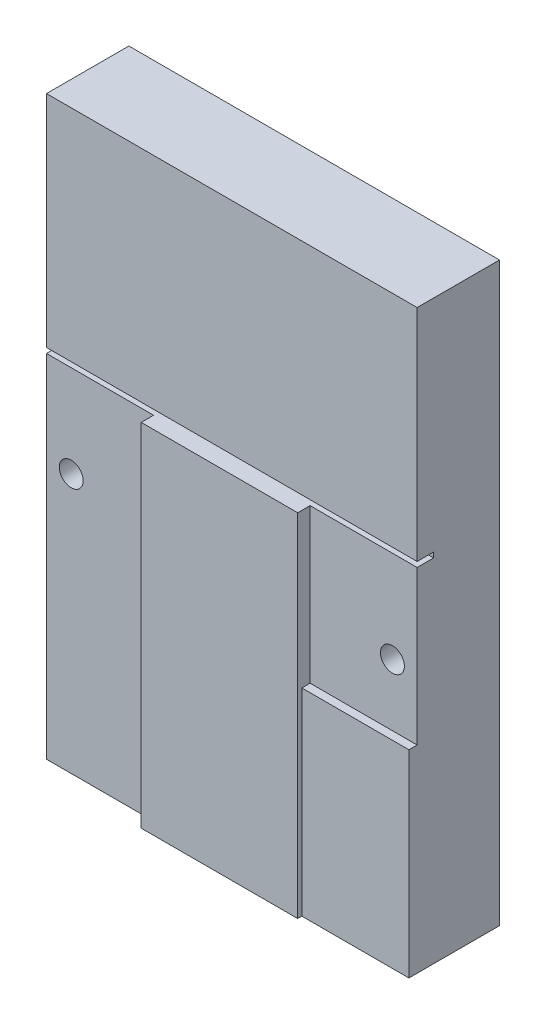
ISO-10303-21;
HEADER;
FILE_DESCRIPTION(('STEP AP214'),'2;1');
FILE_NAME('part.step','',(''),(''),'','','');
FILE_SCHEMA(('AUTOMOTIVE_DESIGN { 1 0 10303 214 1 1 1 1 }'));
ENDSEC;
DATA;
#1=APPLICATION_CONTEXT('core data for automotive mechanical design processes');
#2=APPLICATION_PROTOCOL_DEFINITION('international standard','automotive_design',2000,#1);
#3=PRODUCT_CONTEXT('',#1,'mechanical');
#4=PRODUCT('Part','Part','',(#3));
#5=PRODUCT_RELATED_PRODUCT_CATEGORY('part','',(#4));
#6=PRODUCT_DEFINITION_FORMATION('','',#4);
#7=PRODUCT_DEFINITION_CONTEXT('part definition',#1,'design');
#8=PRODUCT_DEFINITION('design','',#6,#7);
#9=PRODUCT_DEFINITION_SHAPE('','',#8);
#10=(LENGTH_UNIT() NAMED_UNIT(*) SI_UNIT(.MILLI.,.METRE.));
#11=(NAMED_UNIT(*) PLANE_ANGLE_UNIT() SI_UNIT($,.RADIAN.));
#12=(NAMED_UNIT(*) SI_UNIT($,.STERADIAN.) SOLID_ANGLE_UNIT());
#13=UNCERTAINTY_MEASURE_WITH_UNIT(LENGTH_MEASURE(1.E-05),#10,'distance_accuracy_value','');
#14=(GEOMETRIC_REPRESENTATION_CONTEXT(3) GLOBAL_UNCERTAINTY_ASSIGNED_CONTEXT((#13)) GLOBAL_UNIT_ASSIGNED_CONTEXT((#10,
#11,#12)) REPRESENTATION_CONTEXT('',''));
#15=CARTESIAN_POINT('',(0.,0.,0.));
#16=DIRECTION('',(0.,0.,1.));
#17=DIRECTION('',(1.,0.,0.));
#18=AXIS2_PLACEMENT_3D('',#15,#16,#17);
#19=CARTESIAN_POINT('',(22.5,40.,5.));
#20=DIRECTION('',(0.,0.,-1.));
#21=DIRECTION('',(-1.,0.,0.));
#22=AXIS2_PLACEMENT_3D('',#19,#20,#21);
#23=PLANE('',#22);
#24=CARTESIAN_POINT('',(19.5,11.5,5.));
#25=DIRECTION('',(0.,0.,1.));
#26=DIRECTION('',(1.,0.,0.));
#27=AXIS2_PLACEMENT_3D('',#24,#25,#26);
#28=CIRCLE('',#27,1.45);
#29=CARTESIAN_POINT('',(20.95,11.5,5.));
#30=VERTEX_POINT('',#29);
#31=EDGE_CURVE('E222',#30,#30,#28,.T.);
#32=ORIENTED_EDGE('',*,*,#31,.F.);
#33=EDGE_LOOP('',(#32));
#34=FACE_BOUND('',#33,.T.);
#35=DIRECTION('',(-1.,0.,0.));
#36=VECTOR('',#35,1.);
#37=CARTESIAN_POINT('',(0.,4.,5.));
#38=LINE('',#37,#36);
#39=CARTESIAN_POINT('',(22.5,4.,5.));
#40=VERTEX_POINT('',#39);
#41=CARTESIAN_POINT('',(9.49999999999999,4.,5.));
#42=VERTEX_POINT('',#41);
#43=EDGE_CURVE('E162',#40,#42,#38,.T.);
#44=ORIENTED_EDGE('',*,*,#43,.F.);
#45=DIRECTION('',(0.,-1.,0.));
#46=VECTOR('',#45,1.);
#47=CARTESIAN_POINT('',(22.5,40.,5.));
#48=LINE('',#47,#46);
#49=CARTESIAN_POINT('',(22.5,22.6713275749144,5.));
#50=VERTEX_POINT('',#49);
#51=EDGE_CURVE('E169',#50,#40,#48,.T.);
#52=ORIENTED_EDGE('',*,*,#51,.F.);
#53=DIRECTION('',(1.,0.,0.));
#54=VECTOR('',#53,1.);
#55=CARTESIAN_POINT('',(-22.5,22.6713275749144,5.));
#56=LINE('',#55,#54);
#57=CARTESIAN_POINT('',(9.49999999999998,22.6713275749144,5.));
#58=VERTEX_POINT('',#57);
#59=EDGE_CURVE('E196',#58,#50,#56,.T.);
#60=ORIENTED_EDGE('',*,*,#59,.F.);
#61=DIRECTION('',(0.,1.,0.));
#62=VECTOR('',#61,1.);
#63=CARTESIAN_POINT('',(9.49999999999999,22.6713275749144,5.));
#64=LINE('',#63,#62);
#65=EDGE_CURVE('E67',#42,#58,#64,.T.);
#66=ORIENTED_EDGE('',*,*,#65,.F.);
#67=EDGE_LOOP('',(#44,#52,#60,#66));
#68=FACE_BOUND('',#67,.T.);
#69=ADVANCED_FACE('F43',(#34,#68),#23,.F.);
#70=CARTESIAN_POINT('',(9.49999999999999,22.6713275749144,6.5));
#71=DIRECTION('',(-1.,0.,0.));
#72=DIRECTION('',(0.,-1.,0.));
#73=AXIS2_PLACEMENT_3D('',#70,#71,#72);
#74=PLANE('',#73);
#75=DIRECTION('',(0.,0.,-1.));
#76=VECTOR('',#75,1.);
#77=CARTESIAN_POINT('',(9.49999999999999,4.,6.));
#78=LINE('',#77,#76);
#79=CARTESIAN_POINT('',(9.49999999999999,4.,6.));
#80=VERTEX_POINT('',#79);
#81=EDGE_CURVE('E60',#80,#42,#78,.T.);
#82=ORIENTED_EDGE('',*,*,#81,.T.);
#83=ORIENTED_EDGE('',*,*,#65,.T.);
#84=DIRECTION('',(0.,0.,-1.));
#85=VECTOR('',#84,1.);
#86=CARTESIAN_POINT('',(9.49999999999999,22.6713275749144,6.5));
#87=LINE('',#86,#85);
#88=CARTESIAN_POINT('',(9.49999999999999,22.6713275749144,6.5));
#89=VERTEX_POINT('',#88);
#90=EDGE_CURVE('E189',#89,#58,#87,.T.);
#91=ORIENTED_EDGE('',*,*,#90,.F.);
#92=DIRECTION('',(0.,1.,0.));
#93=VECTOR('',#92,1.);
#94=CARTESIAN_POINT('',(9.49999999999999,22.6713275749144,6.5));
#95=LINE('',#94,#93);
#96=CARTESIAN_POINT('',(9.5,-20.,6.5));
#97=VERTEX_POINT('',#96);
#98=EDGE_CURVE('E182',#97,#89,#95,.T.);
#99=ORIENTED_EDGE('',*,*,#98,.F.);
#100=DIRECTION('',(0.,0.,-1.));
#101=VECTOR('',#100,1.);
#102=CARTESIAN_POINT('',(9.5,-20.,6.5));
#103=LINE('',#102,#101);
#104=CARTESIAN_POINT('',(9.49999999999998,-20.,6.));
#105=VERTEX_POINT('',#104);
#106=EDGE_CURVE('E191',#97,#105,#103,.T.);
#107=ORIENTED_EDGE('',*,*,#106,.T.);
#108=DIRECTION('',(0.,-1.,0.));
#109=VECTOR('',#108,1.);
#110=CARTESIAN_POINT('',(9.49999999999999,0.,6.));
#111=LINE('',#110,#109);
#112=EDGE_CURVE('E152',#80,#105,#111,.T.);
#113=ORIENTED_EDGE('',*,*,#112,.F.);
#114=EDGE_LOOP('',(#82,#83,#91,#99,#107,#113));
#115=FACE_BOUND('',#114,.T.);
#116=ADVANCED_FACE('F282',(#115),#74,.F.);
#117=CARTESIAN_POINT('',(-19.5,11.5,5.));
#118=DIRECTION('',(0.,0.,1.));
#119=DIRECTION('',(1.,0.,0.));
#120=AXIS2_PLACEMENT_3D('',#117,#118,#119);
#121=CIRCLE('',#120,1.45);
#122=CARTESIAN_POINT('',(-18.05,11.5,5.));
#123=VERTEX_POINT('',#122);
#124=EDGE_CURVE('E216',#123,#123,#121,.T.);
#125=ORIENTED_EDGE('',*,*,#124,.F.);
#126=EDGE_LOOP('',(#125));
#127=FACE_BOUND('',#126,.T.);
#128=DIRECTION('',(0.,-1.,0.));
#129=VECTOR('',#128,1.);
#130=CARTESIAN_POINT('',(-9.50000000000001,22.6713275749144,5.));
#131=LINE('',#130,#129);
#132=CARTESIAN_POINT('',(-9.50000000000001,22.6713275749144,5.));
#133=VERTEX_POINT('',#132);
#134=CARTESIAN_POINT('',(-9.5,-20.,5.));
#135=VERTEX_POINT('',#134);
#136=EDGE_CURVE('E170',#133,#135,#131,.T.);
#137=ORIENTED_EDGE('',*,*,#136,.F.);
#138=CARTESIAN_POINT('',(-22.5,22.6713275749144,5.));
#139=VERTEX_POINT('',#138);
#140=EDGE_CURVE('E209',#139,#133,#56,.T.);
#141=ORIENTED_EDGE('',*,*,#140,.F.);
#142=DIRECTION('',(0.,-1.,0.));
#143=VECTOR('',#142,1.);
#144=CARTESIAN_POINT('',(-22.5,40.,5.00000000000001));
#145=LINE('',#144,#143);
#146=CARTESIAN_POINT('',(-22.5,-20.,5.00000000000001));
#147=VERTEX_POINT('',#146);
#148=EDGE_CURVE('E52',#139,#147,#145,.T.);
#149=ORIENTED_EDGE('',*,*,#148,.T.);
#150=DIRECTION('',(-1.,0.,0.));
#151=VECTOR('',#150,1.);
#152=CARTESIAN_POINT('',(-22.5,-20.,5.00000000000001));
#153=LINE('',#152,#151);
#154=EDGE_CURVE('E236',#135,#147,#153,.T.);
#155=ORIENTED_EDGE('',*,*,#154,.F.);
#156=EDGE_LOOP('',(#137,#141,#149,#155));
#157=FACE_BOUND('',#156,.T.);
#158=ADVANCED_FACE('F285',(#127,#157),#23,.F.);
#159=CARTESIAN_POINT('',(-22.5,50.,5.));
#160=VERTEX_POINT('',#159);
#161=CARTESIAN_POINT('',(-22.5,23.2974929319475,5.));
#162=VERTEX_POINT('',#161);
#163=EDGE_CURVE('E11',#160,#162,#145,.T.);
#164=ORIENTED_EDGE('',*,*,#163,.T.);
#165=DIRECTION('',(-1.,0.,0.));
#166=VECTOR('',#165,1.);
#167=CARTESIAN_POINT('',(-22.5,23.2974929319475,5.));
#168=LINE('',#167,#166);
#169=CARTESIAN_POINT('',(22.5,23.2974929319475,5.));
#170=VERTEX_POINT('',#169);
#171=EDGE_CURVE('E201',#170,#162,#168,.T.);
#172=ORIENTED_EDGE('',*,*,#171,.F.);
#173=CARTESIAN_POINT('',(22.5,50.,5.));
#174=VERTEX_POINT('',#173);
#175=EDGE_CURVE('E254',#174,#170,#48,.T.);
#176=ORIENTED_EDGE('',*,*,#175,.F.);
#177=DIRECTION('',(1.,0.,0.));
#178=VECTOR('',#177,1.);
#179=CARTESIAN_POINT('',(-22.5,50.,5.));
#180=LINE('',#179,#178);
#181=EDGE_CURVE('E241',#160,#174,#180,.T.);
#182=ORIENTED_EDGE('',*,*,#181,.F.);
#183=EDGE_LOOP('',(#164,#172,#176,#182));
#184=FACE_BOUND('',#183,.T.);
#185=ADVANCED_FACE('F284',(#184),#23,.F.);
#186=CARTESIAN_POINT('',(-22.5,40.,-4.99999999999999));
#187=DIRECTION('',(1.,0.,0.));
#188=DIRECTION('',(0.,0.,-1.));
#189=AXIS2_PLACEMENT_3D('',#186,#187,#188);
#190=PLANE('',#189);
#191=DIRECTION('',(0.,-1.,0.));
#192=VECTOR('',#191,1.);
#193=CARTESIAN_POINT('',(-22.5,23.2974929319475,3.));
#194=LINE('',#193,#192);
#195=CARTESIAN_POINT('',(-22.5,23.2974929319475,3.));
#196=VERTEX_POINT('',#195);
#197=CARTESIAN_POINT('',(-22.5,22.6713275749144,3.));
#198=VERTEX_POINT('',#197);
#199=EDGE_CURVE('E197',#196,#198,#194,.T.);
#200=ORIENTED_EDGE('',*,*,#199,.F.);
#201=DIRECTION('',(0.,0.,1.));
#202=VECTOR('',#201,1.);
#203=CARTESIAN_POINT('',(-22.5,23.2974929319475,3.));
#204=LINE('',#203,#202);
#205=EDGE_CURVE('E213',#196,#162,#204,.T.);
#206=ORIENTED_EDGE('',*,*,#205,.T.);
#207=ORIENTED_EDGE('',*,*,#163,.F.);
#208=DIRECTION('',(0.,0.,1.));
#209=VECTOR('',#208,1.);
#210=CARTESIAN_POINT('',(-22.5,50.,-4.99999999999999));
#211=LINE('',#210,#209);
#212=CARTESIAN_POINT('',(-22.5,50.,-4.99999999999999));
#213=VERTEX_POINT('',#212);
#214=EDGE_CURVE('E238',#213,#160,#211,.T.);
#215=ORIENTED_EDGE('',*,*,#214,.F.);
#216=DIRECTION('',(0.,-1.,0.));
#217=VECTOR('',#216,1.);
#218=CARTESIAN_POINT('',(-22.5,40.,-4.99999999999999));
#219=LINE('',#218,#217);
#220=CARTESIAN_POINT('',(-22.5,-20.,-5.));
#221=VERTEX_POINT('',#220);
#222=EDGE_CURVE('E250',#213,#221,#219,.T.);
#223=ORIENTED_EDGE('',*,*,#222,.T.);
#224=DIRECTION('',(0.,0.,-1.));
#225=VECTOR('',#224,1.);
#226=CARTESIAN_POINT('',(-22.5,-20.,5.00000000000001));
#227=LINE('',#226,#225);
#228=EDGE_CURVE('E228',#147,#221,#227,.T.);
#229=ORIENTED_EDGE('',*,*,#228,.F.);
#230=ORIENTED_EDGE('',*,*,#148,.F.);
#231=DIRECTION('',(0.,0.,1.));
#232=VECTOR('',#231,1.);
#233=CARTESIAN_POINT('',(-22.5,22.6713275749144,3.));
#234=LINE('',#233,#232);
#235=EDGE_CURVE('E208',#198,#139,#234,.T.);
#236=ORIENTED_EDGE('',*,*,#235,.F.);
#237=EDGE_LOOP('',(#200,#206,#207,#215,#223,#229,#230,#236));
#238=FACE_BOUND('',#237,.T.);
#239=ADVANCED_FACE('F45',(#238),#190,.F.);
#240=CARTESIAN_POINT('',(22.5,40.,-5.));
#241=DIRECTION('',(-1.,0.,0.));
#242=DIRECTION('',(0.,0.,1.));
#243=AXIS2_PLACEMENT_3D('',#240,#241,#242);
#244=PLANE('',#243);
#245=ORIENTED_EDGE('',*,*,#175,.T.);
#246=DIRECTION('',(0.,0.,1.));
#247=VECTOR('',#246,1.);
#248=CARTESIAN_POINT('',(22.5,23.2974929319475,3.));
#249=LINE('',#248,#247);
#250=CARTESIAN_POINT('',(22.5,23.2974929319475,3.));
#251=VERTEX_POINT('',#250);
#252=EDGE_CURVE('E217',#251,#170,#249,.T.);
#253=ORIENTED_EDGE('',*,*,#252,.F.);
#254=DIRECTION('',(0.,1.,0.));
#255=VECTOR('',#254,1.);
#256=CARTESIAN_POINT('',(22.5,23.2974929319475,3.));
#257=LINE('',#256,#255);
#258=CARTESIAN_POINT('',(22.5,22.6713275749144,3.));
#259=VERTEX_POINT('',#258);
#260=EDGE_CURVE('E203',#259,#251,#257,.T.);
#261=ORIENTED_EDGE('',*,*,#260,.F.);
#262=DIRECTION('',(0.,0.,1.));
#263=VECTOR('',#262,1.);
#264=CARTESIAN_POINT('',(22.5,22.6713275749144,3.));
#265=LINE('',#264,#263);
#266=EDGE_CURVE('E219',#259,#50,#265,.T.);
#267=ORIENTED_EDGE('',*,*,#266,.T.);
#268=ORIENTED_EDGE('',*,*,#51,.T.);
#269=DIRECTION('',(0.,0.,-1.));
#270=VECTOR('',#269,1.);
#271=CARTESIAN_POINT('',(22.5,4.,6.));
#272=LINE('',#271,#270);
#273=CARTESIAN_POINT('',(22.5,4.,6.));
#274=VERTEX_POINT('',#273);
#275=EDGE_CURVE('E148',#274,#40,#272,.T.);
#276=ORIENTED_EDGE('',*,*,#275,.F.);
#277=DIRECTION('',(0.,1.,0.));
#278=VECTOR('',#277,1.);
#279=CARTESIAN_POINT('',(22.5,0.,6.));
#280=LINE('',#279,#278);
#281=CARTESIAN_POINT('',(22.5,-20.,6.));
#282=VERTEX_POINT('',#281);
#283=EDGE_CURVE('E153',#282,#274,#280,.T.);
#284=ORIENTED_EDGE('',*,*,#283,.F.);
#285=DIRECTION('',(0.,0.,1.));
#286=VECTOR('',#285,1.);
#287=CARTESIAN_POINT('',(22.5,-20.,5.00000000000001));
#288=LINE('',#287,#286);
#289=CARTESIAN_POINT('',(22.5,-20.,-5.));
#290=VERTEX_POINT('',#289);
#291=EDGE_CURVE('E234',#290,#282,#288,.T.);
#292=ORIENTED_EDGE('',*,*,#291,.F.);
#293=DIRECTION('',(0.,-1.,0.));
#294=VECTOR('',#293,1.);
#295=CARTESIAN_POINT('',(22.5,40.,-5.));
#296=LINE('',#295,#294);
#297=CARTESIAN_POINT('',(22.5,50.,-4.99999999999999));
#298=VERTEX_POINT('',#297);
#299=EDGE_CURVE('E252',#298,#290,#296,.T.);
#300=ORIENTED_EDGE('',*,*,#299,.F.);
#301=DIRECTION('',(0.,0.,-1.));
#302=VECTOR('',#301,1.);
#303=CARTESIAN_POINT('',(22.5,50.,-4.99999999999999));
#304=LINE('',#303,#302);
#305=EDGE_CURVE('E244',#174,#298,#304,.T.);
#306=ORIENTED_EDGE('',*,*,#305,.F.);
#307=EDGE_LOOP('',(#245,#253,#261,#267,#268,#276,#284,#292,#300,#306));
#308=FACE_BOUND('',#307,.T.);
#309=ADVANCED_FACE('F166',(#308),#244,.F.);
#310=CARTESIAN_POINT('',(22.5,40.,-5.));
#311=DIRECTION('',(0.,0.,1.));
#312=DIRECTION('',(1.,0.,0.));
#313=AXIS2_PLACEMENT_3D('',#310,#311,#312);
#314=PLANE('',#313);
#315=CARTESIAN_POINT('',(19.5,11.5,-5.));
#316=DIRECTION('',(0.,0.,1.));
#317=DIRECTION('',(1.,0.,0.));
#318=AXIS2_PLACEMENT_3D('',#315,#316,#317);
#319=CIRCLE('',#318,1.45);
#320=CARTESIAN_POINT('',(20.95,11.5,-5.));
#321=VERTEX_POINT('',#320);
#322=EDGE_CURVE('E47',#321,#321,#319,.T.);
#323=ORIENTED_EDGE('',*,*,#322,.T.);
#324=EDGE_LOOP('',(#323));
#325=FACE_BOUND('',#324,.T.);
#326=CARTESIAN_POINT('',(-19.5,11.5,-4.99999999999999));
#327=DIRECTION('',(0.,0.,1.));
#328=DIRECTION('',(1.,0.,0.));
#329=AXIS2_PLACEMENT_3D('',#326,#327,#328);
#330=CIRCLE('',#329,1.45);
#331=CARTESIAN_POINT('',(-18.05,11.5,-4.99999999999999));
#332=VERTEX_POINT('',#331);
#333=EDGE_CURVE('E225',#332,#332,#330,.T.);
#334=ORIENTED_EDGE('',*,*,#333,.T.);
#335=EDGE_LOOP('',(#334));
#336=FACE_BOUND('',#335,.T.);
#337=ORIENTED_EDGE('',*,*,#299,.T.);
#338=DIRECTION('',(1.,0.,0.));
#339=VECTOR('',#338,1.);
#340=CARTESIAN_POINT('',(-22.5,-20.,-5.));
#341=LINE('',#340,#339);
#342=EDGE_CURVE('E231',#221,#290,#341,.T.);
#343=ORIENTED_EDGE('',*,*,#342,.F.);
#344=ORIENTED_EDGE('',*,*,#222,.F.);
#345=DIRECTION('',(-1.,0.,0.));
#346=VECTOR('',#345,1.);
#347=CARTESIAN_POINT('',(-22.5,50.,-4.99999999999999));
#348=LINE('',#347,#346);
#349=EDGE_CURVE('E247',#298,#213,#348,.T.);
#350=ORIENTED_EDGE('',*,*,#349,.F.);
#351=EDGE_LOOP('',(#337,#343,#344,#350));
#352=FACE_BOUND('',#351,.T.);
#353=ADVANCED_FACE('F261',(#325,#336,#352),#314,.F.);
#354=CARTESIAN_POINT('',(0.,50.,0.));
#355=DIRECTION('',(0.,1.,0.));
#356=DIRECTION('',(0.,0.,1.));
#357=AXIS2_PLACEMENT_3D('',#354,#355,#356);
#358=PLANE('',#357);
#359=ORIENTED_EDGE('',*,*,#214,.T.);
#360=ORIENTED_EDGE('',*,*,#181,.T.);
#361=ORIENTED_EDGE('',*,*,#305,.T.);
#362=ORIENTED_EDGE('',*,*,#349,.T.);
#363=EDGE_LOOP('',(#359,#360,#361,#362));
#364=FACE_BOUND('',#363,.T.);
#365=ADVANCED_FACE('F334',(#364),#358,.T.);
#366=CARTESIAN_POINT('',(0.,-20.,0.));
#367=DIRECTION('',(0.,-1.,0.));
#368=DIRECTION('',(0.,0.,-1.));
#369=AXIS2_PLACEMENT_3D('',#366,#367,#368);
#370=PLANE('',#369);
#371=ORIENTED_EDGE('',*,*,#228,.T.);
#372=ORIENTED_EDGE('',*,*,#342,.T.);
#373=ORIENTED_EDGE('',*,*,#291,.T.);
#374=DIRECTION('',(1.,0.,0.));
#375=VECTOR('',#374,1.);
#376=CARTESIAN_POINT('',(0.,-20.,6.));
#377=LINE('',#376,#375);
#378=EDGE_CURVE('E159',#105,#282,#377,.T.);
#379=ORIENTED_EDGE('',*,*,#378,.F.);
#380=ORIENTED_EDGE('',*,*,#106,.F.);
#381=DIRECTION('',(1.,0.,0.));
#382=VECTOR('',#381,1.);
#383=CARTESIAN_POINT('',(-9.5,-20.,6.5));
#384=LINE('',#383,#382);
#385=CARTESIAN_POINT('',(-9.5,-20.,6.5));
#386=VERTEX_POINT('',#385);
#387=EDGE_CURVE('E180',#386,#97,#384,.T.);
#388=ORIENTED_EDGE('',*,*,#387,.F.);
#389=DIRECTION('',(0.,0.,-1.));
#390=VECTOR('',#389,1.);
#391=CARTESIAN_POINT('',(-9.5,-20.,6.5));
#392=LINE('',#391,#390);
#393=EDGE_CURVE('E194',#386,#135,#392,.T.);
#394=ORIENTED_EDGE('',*,*,#393,.T.);
#395=ORIENTED_EDGE('',*,*,#154,.T.);
#396=EDGE_LOOP('',(#371,#372,#373,#379,#380,#388,#394,#395));
#397=FACE_BOUND('',#396,.T.);
#398=ADVANCED_FACE('F277',(#397),#370,.T.);
#399=CARTESIAN_POINT('',(-19.5,11.5,-15.));
#400=DIRECTION('',(0.,0.,1.));
#401=DIRECTION('',(1.,0.,0.));
#402=AXIS2_PLACEMENT_3D('',#399,#400,#401);
#403=CYLINDRICAL_SURFACE('',#402,1.45);
#404=ORIENTED_EDGE('',*,*,#124,.T.);
#405=EDGE_LOOP('',(#404));
#406=FACE_BOUND('',#405,.T.);
#407=ORIENTED_EDGE('',*,*,#333,.F.);
#408=EDGE_LOOP('',(#407));
#409=FACE_BOUND('',#408,.T.);
#410=ADVANCED_FACE('F266',(#406,#409),#403,.F.);
#411=CARTESIAN_POINT('',(19.5,11.5,-15.));
#412=DIRECTION('',(0.,0.,1.));
#413=DIRECTION('',(1.,0.,0.));
#414=AXIS2_PLACEMENT_3D('',#411,#412,#413);
#415=CYLINDRICAL_SURFACE('',#414,1.45);
#416=ORIENTED_EDGE('',*,*,#31,.T.);
#417=EDGE_LOOP('',(#416));
#418=FACE_BOUND('',#417,.T.);
#419=ORIENTED_EDGE('',*,*,#322,.F.);
#420=EDGE_LOOP('',(#419));
#421=FACE_BOUND('',#420,.T.);
#422=ADVANCED_FACE('F263',(#418,#421),#415,.F.);
#423=CARTESIAN_POINT('',(-22.5,23.2974929319475,3.));
#424=DIRECTION('',(0.,1.,0.));
#425=DIRECTION('',(0.,0.,1.));
#426=AXIS2_PLACEMENT_3D('',#423,#424,#425);
#427=PLANE('',#426);
#428=ORIENTED_EDGE('',*,*,#171,.T.);
#429=ORIENTED_EDGE('',*,*,#205,.F.);
#430=DIRECTION('',(-1.,0.,0.));
#431=VECTOR('',#430,1.);
#432=CARTESIAN_POINT('',(-22.5,23.2974929319475,3.));
#433=LINE('',#432,#431);
#434=EDGE_CURVE('E205',#251,#196,#433,.T.);
#435=ORIENTED_EDGE('',*,*,#434,.F.);
#436=ORIENTED_EDGE('',*,*,#252,.T.);
#437=EDGE_LOOP('',(#428,#429,#435,#436));
#438=FACE_BOUND('',#437,.T.);
#439=ADVANCED_FACE('F265',(#438),#427,.F.);
#440=CARTESIAN_POINT('',(-22.5,22.6713275749144,3.));
#441=DIRECTION('',(0.,-1.,0.));
#442=DIRECTION('',(0.,0.,-1.));
#443=AXIS2_PLACEMENT_3D('',#440,#441,#442);
#444=PLANE('',#443);
#445=ORIENTED_EDGE('',*,*,#140,.T.);
#446=DIRECTION('',(0.,0.,-1.));
#447=VECTOR('',#446,1.);
#448=CARTESIAN_POINT('',(-9.50000000000001,22.6713275749144,6.5));
#449=LINE('',#448,#447);
#450=CARTESIAN_POINT('',(-9.50000000000001,22.6713275749144,6.5));
#451=VERTEX_POINT('',#450);
#452=EDGE_CURVE('E185',#451,#133,#449,.T.);
#453=ORIENTED_EDGE('',*,*,#452,.F.);
#454=DIRECTION('',(-1.,0.,0.));
#455=VECTOR('',#454,1.);
#456=CARTESIAN_POINT('',(-9.50000000000001,22.6713275749144,6.5));
#457=LINE('',#456,#455);
#458=EDGE_CURVE('E184',#89,#451,#457,.T.);
#459=ORIENTED_EDGE('',*,*,#458,.F.);
#460=ORIENTED_EDGE('',*,*,#90,.T.);
#461=ORIENTED_EDGE('',*,*,#59,.T.);
#462=ORIENTED_EDGE('',*,*,#266,.F.);
#463=DIRECTION('',(1.,0.,0.));
#464=VECTOR('',#463,1.);
#465=CARTESIAN_POINT('',(-22.5,22.6713275749144,3.));
#466=LINE('',#465,#464);
#467=EDGE_CURVE('E200',#198,#259,#466,.T.);
#468=ORIENTED_EDGE('',*,*,#467,.F.);
#469=ORIENTED_EDGE('',*,*,#235,.T.);
#470=EDGE_LOOP('',(#445,#453,#459,#460,#461,#462,#468,#469));
#471=FACE_BOUND('',#470,.T.);
#472=ADVANCED_FACE('F274',(#471),#444,.F.);
#473=CARTESIAN_POINT('',(0.,0.,3.));
#474=DIRECTION('',(0.,0.,1.));
#475=DIRECTION('',(1.,0.,0.));
#476=AXIS2_PLACEMENT_3D('',#473,#474,#475);
#477=PLANE('',#476);
#478=ORIENTED_EDGE('',*,*,#199,.T.);
#479=ORIENTED_EDGE('',*,*,#467,.T.);
#480=ORIENTED_EDGE('',*,*,#260,.T.);
#481=ORIENTED_EDGE('',*,*,#434,.T.);
#482=EDGE_LOOP('',(#478,#479,#480,#481));
#483=FACE_BOUND('',#482,.T.);
#484=ADVANCED_FACE('F390',(#483),#477,.T.);
#485=CARTESIAN_POINT('',(-9.50000000000001,22.6713275749144,6.5));
#486=DIRECTION('',(1.,0.,0.));
#487=DIRECTION('',(0.,1.,0.));
#488=AXIS2_PLACEMENT_3D('',#485,#486,#487);
#489=PLANE('',#488);
#490=ORIENTED_EDGE('',*,*,#136,.T.);
#491=ORIENTED_EDGE('',*,*,#393,.F.);
#492=DIRECTION('',(0.,-1.,0.));
#493=VECTOR('',#492,1.);
#494=CARTESIAN_POINT('',(-9.50000000000001,22.6713275749144,6.5));
#495=LINE('',#494,#493);
#496=EDGE_CURVE('E177',#451,#386,#495,.T.);
#497=ORIENTED_EDGE('',*,*,#496,.F.);
#498=ORIENTED_EDGE('',*,*,#452,.T.);
#499=EDGE_LOOP('',(#490,#491,#497,#498));
#500=FACE_BOUND('',#499,.T.);
#501=ADVANCED_FACE('F323',(#500),#489,.F.);
#502=CARTESIAN_POINT('',(0.,0.,6.5));
#503=DIRECTION('',(0.,0.,1.));
#504=DIRECTION('',(1.,0.,0.));
#505=AXIS2_PLACEMENT_3D('',#502,#503,#504);
#506=PLANE('',#505);
#507=ORIENTED_EDGE('',*,*,#496,.T.);
#508=ORIENTED_EDGE('',*,*,#387,.T.);
#509=ORIENTED_EDGE('',*,*,#98,.T.);
#510=ORIENTED_EDGE('',*,*,#458,.T.);
#511=EDGE_LOOP('',(#507,#508,#509,#510));
#512=FACE_BOUND('',#511,.T.);
#513=ADVANCED_FACE('F325',(#512),#506,.T.);
#514=CARTESIAN_POINT('',(0.,4.,6.));
#515=DIRECTION('',(0.,-1.,0.));
#516=DIRECTION('',(0.,0.,-1.));
#517=AXIS2_PLACEMENT_3D('',#514,#515,#516);
#518=PLANE('',#517);
#519=ORIENTED_EDGE('',*,*,#43,.T.);
#520=ORIENTED_EDGE('',*,*,#81,.F.);
#521=DIRECTION('',(-1.,0.,0.));
#522=VECTOR('',#521,1.);
#523=CARTESIAN_POINT('',(0.,4.,6.));
#524=LINE('',#523,#522);
#525=EDGE_CURVE('E144',#274,#80,#524,.T.);
#526=ORIENTED_EDGE('',*,*,#525,.F.);
#527=ORIENTED_EDGE('',*,*,#275,.T.);
#528=EDGE_LOOP('',(#519,#520,#526,#527));
#529=FACE_BOUND('',#528,.T.);
#530=ADVANCED_FACE('F146',(#529),#518,.F.);
#531=CARTESIAN_POINT('',(0.,0.,6.));
#532=DIRECTION('',(0.,0.,1.));
#533=DIRECTION('',(1.,0.,0.));
#534=AXIS2_PLACEMENT_3D('',#531,#532,#533);
#535=PLANE('',#534);
#536=ORIENTED_EDGE('',*,*,#283,.T.);
#537=ORIENTED_EDGE('',*,*,#525,.T.);
#538=ORIENTED_EDGE('',*,*,#112,.T.);
#539=ORIENTED_EDGE('',*,*,#378,.T.);
#540=EDGE_LOOP('',(#536,#537,#538,#539));
#541=FACE_BOUND('',#540,.T.);
#542=ADVANCED_FACE('F157',(#541),#535,.T.);
#543=CLOSED_SHELL('',(#69,#116,#158,#185,#239,#309,#353,#365,#398,#410,#422,#439,#472,#484,#501,
#513,#530,#542));
#544=MANIFOLD_SOLID_BREP('B2',#543);
#545=ADVANCED_BREP_SHAPE_REPRESENTATION('',(#18,#544),#14);
#546=SHAPE_DEFINITION_REPRESENTATION(#9,#545);
ENDSEC;
END-ISO-10303-21;
